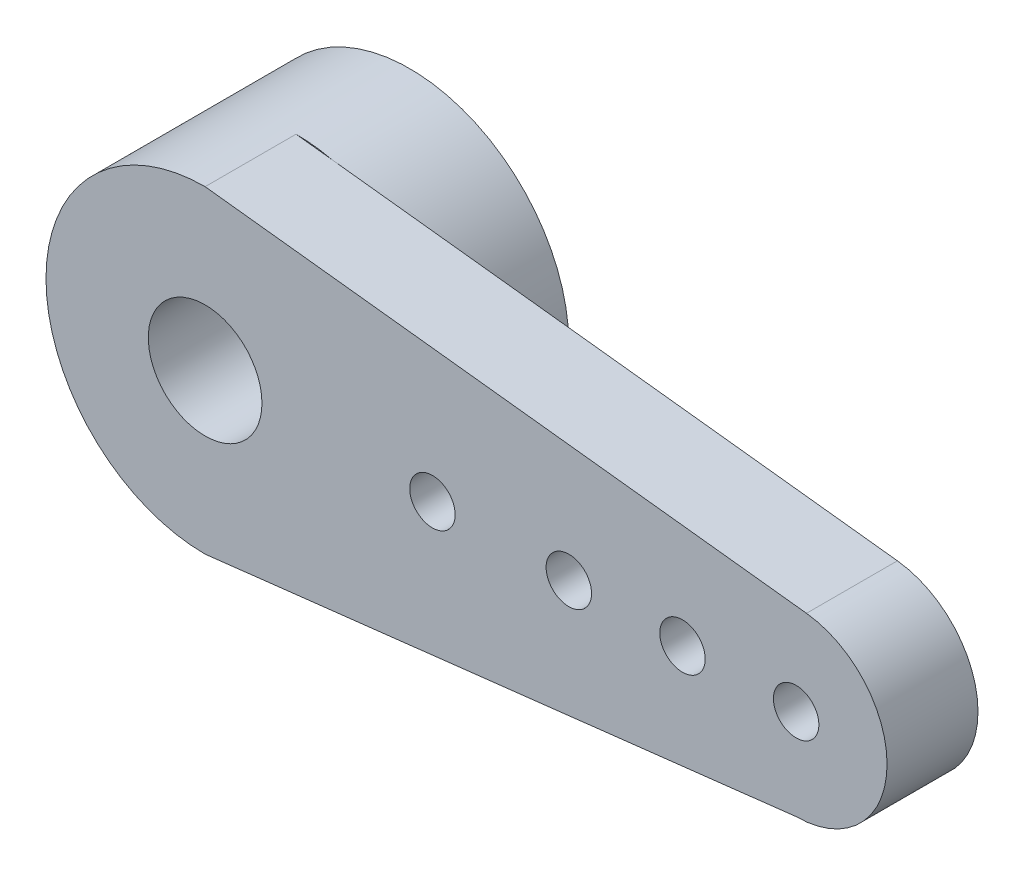
ISO-10303-21;
HEADER;
FILE_DESCRIPTION(('STEP AP214'),'2;1');
FILE_NAME('part.step','',(''),(''),'','','');
FILE_SCHEMA(('AUTOMOTIVE_DESIGN { 1 0 10303 214 1 1 1 1 }'));
ENDSEC;
DATA;
#1=APPLICATION_CONTEXT('core data for automotive mechanical design processes');
#2=APPLICATION_PROTOCOL_DEFINITION('international standard','automotive_design',2000,#1);
#3=PRODUCT_CONTEXT('',#1,'mechanical');
#4=PRODUCT('Part','Part','',(#3));
#5=PRODUCT_RELATED_PRODUCT_CATEGORY('part','',(#4));
#6=PRODUCT_DEFINITION_FORMATION('','',#4);
#7=PRODUCT_DEFINITION_CONTEXT('part definition',#1,'design');
#8=PRODUCT_DEFINITION('design','',#6,#7);
#9=PRODUCT_DEFINITION_SHAPE('','',#8);
#10=(LENGTH_UNIT() NAMED_UNIT(*) SI_UNIT(.MILLI.,.METRE.));
#11=(NAMED_UNIT(*) PLANE_ANGLE_UNIT() SI_UNIT($,.RADIAN.));
#12=(NAMED_UNIT(*) SI_UNIT($,.STERADIAN.) SOLID_ANGLE_UNIT());
#13=UNCERTAINTY_MEASURE_WITH_UNIT(LENGTH_MEASURE(1.E-05),#10,'distance_accuracy_value','');
#14=(GEOMETRIC_REPRESENTATION_CONTEXT(3) GLOBAL_UNCERTAINTY_ASSIGNED_CONTEXT((#13)) GLOBAL_UNIT_ASSIGNED_CONTEXT((#10,
#11,#12)) REPRESENTATION_CONTEXT('',''));
#15=CARTESIAN_POINT('',(0.,0.,0.));
#16=DIRECTION('',(0.,0.,1.));
#17=DIRECTION('',(1.,0.,0.));
#18=AXIS2_PLACEMENT_3D('',#15,#16,#17);
#19=CARTESIAN_POINT('',(0.,0.,0.));
#20=DIRECTION('',(0.,0.,1.));
#21=DIRECTION('',(1.,0.,0.));
#22=AXIS2_PLACEMENT_3D('',#19,#20,#21);
#23=PLANE('',#22);
#24=CARTESIAN_POINT('',(5.,0.,0.));
#25=DIRECTION('',(0.,0.,1.));
#26=DIRECTION('',(1.,0.,0.));
#27=AXIS2_PLACEMENT_3D('',#24,#25,#26);
#28=CIRCLE('',#27,0.500000000000001);
#29=CARTESIAN_POINT('',(5.5,0.,0.));
#30=VERTEX_POINT('',#29);
#31=EDGE_CURVE('E136',#30,#30,#28,.F.);
#32=ORIENTED_EDGE('',*,*,#31,.F.);
#33=EDGE_LOOP('',(#32));
#34=FACE_BOUND('',#33,.T.);
#35=CARTESIAN_POINT('',(8.,0.,0.));
#36=DIRECTION('',(0.,0.,1.));
#37=DIRECTION('',(1.,0.,0.));
#38=AXIS2_PLACEMENT_3D('',#35,#36,#37);
#39=CIRCLE('',#38,0.500000000000001);
#40=CARTESIAN_POINT('',(8.5,0.,0.));
#41=VERTEX_POINT('',#40);
#42=EDGE_CURVE('E142',#41,#41,#39,.F.);
#43=ORIENTED_EDGE('',*,*,#42,.F.);
#44=EDGE_LOOP('',(#43));
#45=FACE_BOUND('',#44,.T.);
#46=CARTESIAN_POINT('',(10.5,0.,0.));
#47=DIRECTION('',(0.,0.,1.));
#48=DIRECTION('',(1.,0.,0.));
#49=AXIS2_PLACEMENT_3D('',#46,#47,#48);
#50=CIRCLE('',#49,0.500000000000001);
#51=CARTESIAN_POINT('',(11.,0.,0.));
#52=VERTEX_POINT('',#51);
#53=EDGE_CURVE('E148',#52,#52,#50,.F.);
#54=ORIENTED_EDGE('',*,*,#53,.F.);
#55=EDGE_LOOP('',(#54));
#56=FACE_BOUND('',#55,.T.);
#57=CARTESIAN_POINT('',(13.,0.,0.));
#58=DIRECTION('',(0.,0.,1.));
#59=DIRECTION('',(1.,0.,0.));
#60=AXIS2_PLACEMENT_3D('',#57,#58,#59);
#61=CIRCLE('',#60,0.500000000000001);
#62=CARTESIAN_POINT('',(13.5,0.,0.));
#63=VERTEX_POINT('',#62);
#64=EDGE_CURVE('E155',#63,#63,#61,.T.);
#65=ORIENTED_EDGE('',*,*,#64,.T.);
#66=EDGE_LOOP('',(#65));
#67=FACE_BOUND('',#66,.T.);
#68=CARTESIAN_POINT('',(0.,0.,0.));
#69=DIRECTION('',(0.,0.,-1.));
#70=DIRECTION('',(-1.,0.,0.));
#71=AXIS2_PLACEMENT_3D('',#68,#69,#70);
#72=CIRCLE('',#71,3.5);
#73=CARTESIAN_POINT('',(0.790330447622657,3.40960082466563,0.));
#74=VERTEX_POINT('',#73);
#75=CARTESIAN_POINT('',(0.797080291970804,-3.40802919708029,0.));
#76=VERTEX_POINT('',#75);
#77=EDGE_CURVE('E11',#74,#76,#72,.T.);
#78=ORIENTED_EDGE('',*,*,#77,.F.);
#79=DIRECTION('',(-0.993521933373939,0.113640520523753,0.));
#80=VECTOR('',#79,1.);
#81=CARTESIAN_POINT('',(0.,3.5,0.));
#82=LINE('',#81,#80);
#83=CARTESIAN_POINT('',(13.2272810410475,1.98704386674788,0.));
#84=VERTEX_POINT('',#83);
#85=EDGE_CURVE('E107',#84,#74,#82,.T.);
#86=ORIENTED_EDGE('',*,*,#85,.F.);
#87=CARTESIAN_POINT('',(13.,0.,0.));
#88=DIRECTION('',(0.,0.,1.));
#89=DIRECTION('',(1.,0.,0.));
#90=AXIS2_PLACEMENT_3D('',#87,#88,#89);
#91=CIRCLE('',#90,2.);
#92=CARTESIAN_POINT('',(13.,-2.,0.));
#93=VERTEX_POINT('',#92);
#94=EDGE_CURVE('E74',#93,#84,#91,.T.);
#95=ORIENTED_EDGE('',*,*,#94,.F.);
#96=DIRECTION('',(0.993408935871131,0.11462410798513,0.));
#97=VECTOR('',#96,1.);
#98=CARTESIAN_POINT('',(0.,-3.5,0.));
#99=LINE('',#98,#97);
#100=EDGE_CURVE('E67',#76,#93,#99,.T.);
#101=ORIENTED_EDGE('',*,*,#100,.F.);
#102=EDGE_LOOP('',(#78,#86,#95,#101));
#103=FACE_BOUND('',#102,.T.);
#104=ADVANCED_FACE('F33',(#34,#45,#56,#67,#103),#23,.F.);
#105=CARTESIAN_POINT('',(0.,0.,2.));
#106=DIRECTION('',(0.,0.,1.));
#107=DIRECTION('',(1.,0.,0.));
#108=AXIS2_PLACEMENT_3D('',#105,#106,#107);
#109=PLANE('',#108);
#110=CARTESIAN_POINT('',(5.,0.,2.));
#111=DIRECTION('',(0.,0.,1.));
#112=DIRECTION('',(1.,0.,0.));
#113=AXIS2_PLACEMENT_3D('',#110,#111,#112);
#114=CIRCLE('',#113,0.500000000000001);
#115=CARTESIAN_POINT('',(5.5,0.,2.));
#116=VERTEX_POINT('',#115);
#117=EDGE_CURVE('E133',#116,#116,#114,.T.);
#118=ORIENTED_EDGE('',*,*,#117,.F.);
#119=EDGE_LOOP('',(#118));
#120=FACE_BOUND('',#119,.T.);
#121=CARTESIAN_POINT('',(8.,0.,2.));
#122=DIRECTION('',(0.,0.,1.));
#123=DIRECTION('',(1.,0.,0.));
#124=AXIS2_PLACEMENT_3D('',#121,#122,#123);
#125=CIRCLE('',#124,0.500000000000001);
#126=CARTESIAN_POINT('',(8.5,0.,2.));
#127=VERTEX_POINT('',#126);
#128=EDGE_CURVE('E139',#127,#127,#125,.T.);
#129=ORIENTED_EDGE('',*,*,#128,.F.);
#130=EDGE_LOOP('',(#129));
#131=FACE_BOUND('',#130,.T.);
#132=CARTESIAN_POINT('',(10.5,0.,2.));
#133=DIRECTION('',(0.,0.,1.));
#134=DIRECTION('',(1.,0.,0.));
#135=AXIS2_PLACEMENT_3D('',#132,#133,#134);
#136=CIRCLE('',#135,0.500000000000001);
#137=CARTESIAN_POINT('',(11.,0.,2.));
#138=VERTEX_POINT('',#137);
#139=EDGE_CURVE('E145',#138,#138,#136,.T.);
#140=ORIENTED_EDGE('',*,*,#139,.F.);
#141=EDGE_LOOP('',(#140));
#142=FACE_BOUND('',#141,.T.);
#143=CARTESIAN_POINT('',(13.,0.,2.));
#144=DIRECTION('',(0.,0.,1.));
#145=DIRECTION('',(1.,0.,0.));
#146=AXIS2_PLACEMENT_3D('',#143,#144,#145);
#147=CIRCLE('',#146,0.500000000000001);
#148=CARTESIAN_POINT('',(13.5,0.,2.));
#149=VERTEX_POINT('',#148);
#150=EDGE_CURVE('E158',#149,#149,#147,.T.);
#151=ORIENTED_EDGE('',*,*,#150,.F.);
#152=EDGE_LOOP('',(#151));
#153=FACE_BOUND('',#152,.T.);
#154=CARTESIAN_POINT('',(0.,0.,2.));
#155=DIRECTION('',(0.,0.,1.));
#156=DIRECTION('',(1.,0.,0.));
#157=AXIS2_PLACEMENT_3D('',#154,#155,#156);
#158=CIRCLE('',#157,3.5);
#159=CARTESIAN_POINT('',(0.,3.5,2.));
#160=VERTEX_POINT('',#159);
#161=CARTESIAN_POINT('',(0.,-3.5,2.));
#162=VERTEX_POINT('',#161);
#163=EDGE_CURVE('E111',#160,#162,#158,.T.);
#164=ORIENTED_EDGE('',*,*,#163,.T.);
#165=DIRECTION('',(0.993408935871131,0.11462410798513,0.));
#166=VECTOR('',#165,1.);
#167=CARTESIAN_POINT('',(0.,-3.5,2.));
#168=LINE('',#167,#166);
#169=CARTESIAN_POINT('',(13.,-2.,2.));
#170=VERTEX_POINT('',#169);
#171=EDGE_CURVE('E80',#162,#170,#168,.T.);
#172=ORIENTED_EDGE('',*,*,#171,.T.);
#173=CARTESIAN_POINT('',(13.,0.,2.));
#174=DIRECTION('',(0.,0.,1.));
#175=DIRECTION('',(1.,0.,0.));
#176=AXIS2_PLACEMENT_3D('',#173,#174,#175);
#177=CIRCLE('',#176,2.);
#178=CARTESIAN_POINT('',(13.2272810410475,1.98704386674788,2.));
#179=VERTEX_POINT('',#178);
#180=EDGE_CURVE('E115',#170,#179,#177,.T.);
#181=ORIENTED_EDGE('',*,*,#180,.T.);
#182=DIRECTION('',(-0.993521933373939,0.113640520523753,0.));
#183=VECTOR('',#182,1.);
#184=CARTESIAN_POINT('',(0.,3.5,2.));
#185=LINE('',#184,#183);
#186=EDGE_CURVE('E52',#179,#160,#185,.T.);
#187=ORIENTED_EDGE('',*,*,#186,.T.);
#188=EDGE_LOOP('',(#164,#172,#181,#187));
#189=FACE_BOUND('',#188,.T.);
#190=CARTESIAN_POINT('',(0.,0.,2.));
#191=DIRECTION('',(0.,0.,1.));
#192=DIRECTION('',(1.,0.,0.));
#193=AXIS2_PLACEMENT_3D('',#190,#191,#192);
#194=CIRCLE('',#193,1.25);
#195=CARTESIAN_POINT('',(1.25,0.,2.));
#196=VERTEX_POINT('',#195);
#197=EDGE_CURVE('E152',#196,#196,#194,.T.);
#198=ORIENTED_EDGE('',*,*,#197,.F.);
#199=EDGE_LOOP('',(#198));
#200=FACE_BOUND('',#199,.T.);
#201=ADVANCED_FACE('F172',(#120,#131,#142,#153,#189,#200),#109,.T.);
#202=CARTESIAN_POINT('',(0.,0.,0.));
#203=DIRECTION('',(0.,0.,-1.));
#204=DIRECTION('',(-1.,0.,0.));
#205=AXIS2_PLACEMENT_3D('',#202,#203,#204);
#206=CIRCLE('',#205,2.5);
#207=CARTESIAN_POINT('',(-2.5,0.,0.));
#208=VERTEX_POINT('',#207);
#209=EDGE_CURVE('E192',#208,#208,#206,.T.);
#210=ORIENTED_EDGE('',*,*,#209,.T.);
#211=EDGE_LOOP('',(#210));
#212=FACE_BOUND('',#211,.T.);
#213=CARTESIAN_POINT('',(0.,0.,0.));
#214=DIRECTION('',(0.,0.,1.));
#215=DIRECTION('',(1.,0.,0.));
#216=AXIS2_PLACEMENT_3D('',#213,#214,#215);
#217=CIRCLE('',#216,1.25);
#218=CARTESIAN_POINT('',(1.25,0.,0.));
#219=VERTEX_POINT('',#218);
#220=EDGE_CURVE('E151',#219,#219,#217,.T.);
#221=ORIENTED_EDGE('',*,*,#220,.T.);
#222=EDGE_LOOP('',(#221));
#223=FACE_BOUND('',#222,.T.);
#224=ADVANCED_FACE('F175',(#212,#223),#23,.F.);
#225=CARTESIAN_POINT('',(0.,0.,2.));
#226=DIRECTION('',(0.,0.,-1.));
#227=DIRECTION('',(-1.,0.,0.));
#228=AXIS2_PLACEMENT_3D('',#225,#226,#227);
#229=CYLINDRICAL_SURFACE('',#228,3.5);
#230=DIRECTION('',(0.,0.,-1.));
#231=VECTOR('',#230,1.);
#232=CARTESIAN_POINT('',(0.,3.5,2.));
#233=LINE('',#232,#231);
#234=CARTESIAN_POINT('',(0.,3.5,0.));
#235=VERTEX_POINT('',#234);
#236=EDGE_CURVE('E104',#160,#235,#233,.T.);
#237=ORIENTED_EDGE('',*,*,#236,.T.);
#238=EDGE_CURVE('E91',#235,#74,#72,.T.);
#239=ORIENTED_EDGE('',*,*,#238,.T.);
#240=ORIENTED_EDGE('',*,*,#77,.T.);
#241=CARTESIAN_POINT('',(0.,-3.5,0.));
#242=VERTEX_POINT('',#241);
#243=EDGE_CURVE('E99',#76,#242,#72,.T.);
#244=ORIENTED_EDGE('',*,*,#243,.T.);
#245=DIRECTION('',(0.,0.,-1.));
#246=VECTOR('',#245,1.);
#247=CARTESIAN_POINT('',(0.,-3.5,2.));
#248=LINE('',#247,#246);
#249=EDGE_CURVE('E43',#162,#242,#248,.T.);
#250=ORIENTED_EDGE('',*,*,#249,.F.);
#251=ORIENTED_EDGE('',*,*,#163,.F.);
#252=EDGE_LOOP('',(#237,#239,#240,#244,#250,#251));
#253=FACE_BOUND('',#252,.T.);
#254=CARTESIAN_POINT('',(0.,0.,-2.5));
#255=DIRECTION('',(0.,0.,-1.));
#256=DIRECTION('',(-1.,0.,0.));
#257=AXIS2_PLACEMENT_3D('',#254,#255,#256);
#258=CIRCLE('',#257,3.5);
#259=CARTESIAN_POINT('',(-3.5,0.,-2.5));
#260=VERTEX_POINT('',#259);
#261=EDGE_CURVE('E98',#260,#260,#258,.T.);
#262=ORIENTED_EDGE('',*,*,#261,.F.);
#263=EDGE_LOOP('',(#262));
#264=FACE_BOUND('',#263,.T.);
#265=ADVANCED_FACE('F35',(#253,#264),#229,.T.);
#266=CARTESIAN_POINT('',(0.,-3.5,2.));
#267=DIRECTION('',(-0.11462410798513,0.993408935871131,0.));
#268=DIRECTION('',(-0.993408935871131,-0.114624107985131,0.));
#269=AXIS2_PLACEMENT_3D('',#266,#267,#268);
#270=PLANE('',#269);
#271=EDGE_CURVE('E127',#242,#76,#99,.T.);
#272=ORIENTED_EDGE('',*,*,#271,.T.);
#273=ORIENTED_EDGE('',*,*,#100,.T.);
#274=DIRECTION('',(0.,0.,-1.));
#275=VECTOR('',#274,1.);
#276=CARTESIAN_POINT('',(13.,-2.,2.));
#277=LINE('',#276,#275);
#278=EDGE_CURVE('E113',#170,#93,#277,.T.);
#279=ORIENTED_EDGE('',*,*,#278,.F.);
#280=ORIENTED_EDGE('',*,*,#171,.F.);
#281=ORIENTED_EDGE('',*,*,#249,.T.);
#282=EDGE_LOOP('',(#272,#273,#279,#280,#281));
#283=FACE_BOUND('',#282,.T.);
#284=ADVANCED_FACE('F167',(#283),#270,.F.);
#285=CARTESIAN_POINT('',(13.,0.,2.));
#286=DIRECTION('',(0.,0.,-1.));
#287=DIRECTION('',(-1.,0.,0.));
#288=AXIS2_PLACEMENT_3D('',#285,#286,#287);
#289=CYLINDRICAL_SURFACE('',#288,2.);
#290=ORIENTED_EDGE('',*,*,#94,.T.);
#291=DIRECTION('',(0.,0.,-1.));
#292=VECTOR('',#291,1.);
#293=CARTESIAN_POINT('',(13.2272810410475,1.98704386674788,2.));
#294=LINE('',#293,#292);
#295=EDGE_CURVE('E112',#179,#84,#294,.T.);
#296=ORIENTED_EDGE('',*,*,#295,.F.);
#297=ORIENTED_EDGE('',*,*,#180,.F.);
#298=ORIENTED_EDGE('',*,*,#278,.T.);
#299=EDGE_LOOP('',(#290,#296,#297,#298));
#300=FACE_BOUND('',#299,.T.);
#301=ADVANCED_FACE('F287',(#300),#289,.T.);
#302=CARTESIAN_POINT('',(0.,3.5,2.));
#303=DIRECTION('',(-0.113640520523753,-0.99352193337394,0.));
#304=DIRECTION('',(0.99352193337394,-0.113640520523753,0.));
#305=AXIS2_PLACEMENT_3D('',#302,#303,#304);
#306=PLANE('',#305);
#307=ORIENTED_EDGE('',*,*,#85,.T.);
#308=EDGE_CURVE('E94',#74,#235,#82,.T.);
#309=ORIENTED_EDGE('',*,*,#308,.T.);
#310=ORIENTED_EDGE('',*,*,#236,.F.);
#311=ORIENTED_EDGE('',*,*,#186,.F.);
#312=ORIENTED_EDGE('',*,*,#295,.T.);
#313=EDGE_LOOP('',(#307,#309,#310,#311,#312));
#314=FACE_BOUND('',#313,.T.);
#315=ADVANCED_FACE('F103',(#314),#306,.F.);
#316=CARTESIAN_POINT('',(13.,0.,2.));
#317=DIRECTION('',(0.,0.,-1.));
#318=DIRECTION('',(-1.,0.,0.));
#319=AXIS2_PLACEMENT_3D('',#316,#317,#318);
#320=CYLINDRICAL_SURFACE('',#319,0.500000000000001);
#321=ORIENTED_EDGE('',*,*,#150,.T.);
#322=EDGE_LOOP('',(#321));
#323=FACE_BOUND('',#322,.T.);
#324=ORIENTED_EDGE('',*,*,#64,.F.);
#325=EDGE_LOOP('',(#324));
#326=FACE_BOUND('',#325,.T.);
#327=ADVANCED_FACE('F198',(#323,#326),#320,.F.);
#328=CARTESIAN_POINT('',(0.,0.,2.));
#329=DIRECTION('',(0.,0.,-1.));
#330=DIRECTION('',(-1.,0.,0.));
#331=AXIS2_PLACEMENT_3D('',#328,#329,#330);
#332=CYLINDRICAL_SURFACE('',#331,1.25);
#333=ORIENTED_EDGE('',*,*,#197,.T.);
#334=EDGE_LOOP('',(#333));
#335=FACE_BOUND('',#334,.T.);
#336=ORIENTED_EDGE('',*,*,#220,.F.);
#337=EDGE_LOOP('',(#336));
#338=FACE_BOUND('',#337,.T.);
#339=ADVANCED_FACE('F195',(#335,#338),#332,.F.);
#340=CARTESIAN_POINT('',(10.5,0.,-0.00100000000000013));
#341=DIRECTION('',(0.,0.,1.));
#342=DIRECTION('',(1.,0.,0.));
#343=AXIS2_PLACEMENT_3D('',#340,#341,#342);
#344=CYLINDRICAL_SURFACE('',#343,0.500000000000001);
#345=ORIENTED_EDGE('',*,*,#139,.T.);
#346=EDGE_LOOP('',(#345));
#347=FACE_BOUND('',#346,.T.);
#348=ORIENTED_EDGE('',*,*,#53,.T.);
#349=EDGE_LOOP('',(#348));
#350=FACE_BOUND('',#349,.T.);
#351=ADVANCED_FACE('F197',(#347,#350),#344,.F.);
#352=CARTESIAN_POINT('',(8.,0.,-0.00100000000000013));
#353=DIRECTION('',(0.,0.,1.));
#354=DIRECTION('',(1.,0.,0.));
#355=AXIS2_PLACEMENT_3D('',#352,#353,#354);
#356=CYLINDRICAL_SURFACE('',#355,0.500000000000001);
#357=ORIENTED_EDGE('',*,*,#128,.T.);
#358=EDGE_LOOP('',(#357));
#359=FACE_BOUND('',#358,.T.);
#360=ORIENTED_EDGE('',*,*,#42,.T.);
#361=EDGE_LOOP('',(#360));
#362=FACE_BOUND('',#361,.T.);
#363=ADVANCED_FACE('F205',(#359,#362),#356,.F.);
#364=CARTESIAN_POINT('',(5.,0.,-0.00100000000000013));
#365=DIRECTION('',(0.,0.,1.));
#366=DIRECTION('',(1.,0.,0.));
#367=AXIS2_PLACEMENT_3D('',#364,#365,#366);
#368=CYLINDRICAL_SURFACE('',#367,0.500000000000001);
#369=ORIENTED_EDGE('',*,*,#117,.T.);
#370=EDGE_LOOP('',(#369));
#371=FACE_BOUND('',#370,.T.);
#372=ORIENTED_EDGE('',*,*,#31,.T.);
#373=EDGE_LOOP('',(#372));
#374=FACE_BOUND('',#373,.T.);
#375=ADVANCED_FACE('F213',(#371,#374),#368,.F.);
#376=CARTESIAN_POINT('',(0.,0.,0.));
#377=DIRECTION('',(0.,0.,-1.));
#378=DIRECTION('',(-1.,0.,0.));
#379=AXIS2_PLACEMENT_3D('',#376,#377,#378);
#380=PLANE('',#379);
#381=ORIENTED_EDGE('',*,*,#308,.F.);
#382=ORIENTED_EDGE('',*,*,#238,.F.);
#383=EDGE_LOOP('',(#381,#382));
#384=FACE_BOUND('',#383,.T.);
#385=ADVANCED_FACE('F93',(#384),#380,.F.);
#386=CARTESIAN_POINT('',(0.,0.,-2.5));
#387=DIRECTION('',(0.,0.,-1.));
#388=DIRECTION('',(-1.,0.,0.));
#389=AXIS2_PLACEMENT_3D('',#386,#387,#388);
#390=PLANE('',#389);
#391=ORIENTED_EDGE('',*,*,#261,.T.);
#392=EDGE_LOOP('',(#391));
#393=FACE_BOUND('',#392,.T.);
#394=CARTESIAN_POINT('',(0.,0.,-2.5));
#395=DIRECTION('',(0.,0.,-1.));
#396=DIRECTION('',(-1.,0.,0.));
#397=AXIS2_PLACEMENT_3D('',#394,#395,#396);
#398=CIRCLE('',#397,2.5);
#399=CARTESIAN_POINT('',(-2.5,0.,-2.5));
#400=VERTEX_POINT('',#399);
#401=EDGE_CURVE('E132',#400,#400,#398,.T.);
#402=ORIENTED_EDGE('',*,*,#401,.F.);
#403=EDGE_LOOP('',(#402));
#404=FACE_BOUND('',#403,.T.);
#405=ADVANCED_FACE('F221',(#393,#404),#390,.T.);
#406=ORIENTED_EDGE('',*,*,#271,.F.);
#407=ORIENTED_EDGE('',*,*,#243,.F.);
#408=EDGE_LOOP('',(#406,#407));
#409=FACE_BOUND('',#408,.T.);
#410=ADVANCED_FACE('F169',(#409),#380,.F.);
#411=CARTESIAN_POINT('',(0.,0.,-2.5));
#412=DIRECTION('',(0.,0.,1.));
#413=DIRECTION('',(1.,0.,0.));
#414=AXIS2_PLACEMENT_3D('',#411,#412,#413);
#415=CYLINDRICAL_SURFACE('',#414,2.5);
#416=ORIENTED_EDGE('',*,*,#401,.T.);
#417=EDGE_LOOP('',(#416));
#418=FACE_BOUND('',#417,.T.);
#419=ORIENTED_EDGE('',*,*,#209,.F.);
#420=EDGE_LOOP('',(#419));
#421=FACE_BOUND('',#420,.T.);
#422=ADVANCED_FACE('F220',(#418,#421),#415,.F.);
#423=CLOSED_SHELL('',(#104,#201,#224,#265,#284,#301,#315,#327,#339,#351,#363,#375,#385,#405,
#410,#422));
#424=MANIFOLD_SOLID_BREP('B2',#423);
#425=ADVANCED_BREP_SHAPE_REPRESENTATION('',(#18,#424),#14);
#426=SHAPE_DEFINITION_REPRESENTATION(#9,#425);
ENDSEC;
END-ISO-10303-21;
